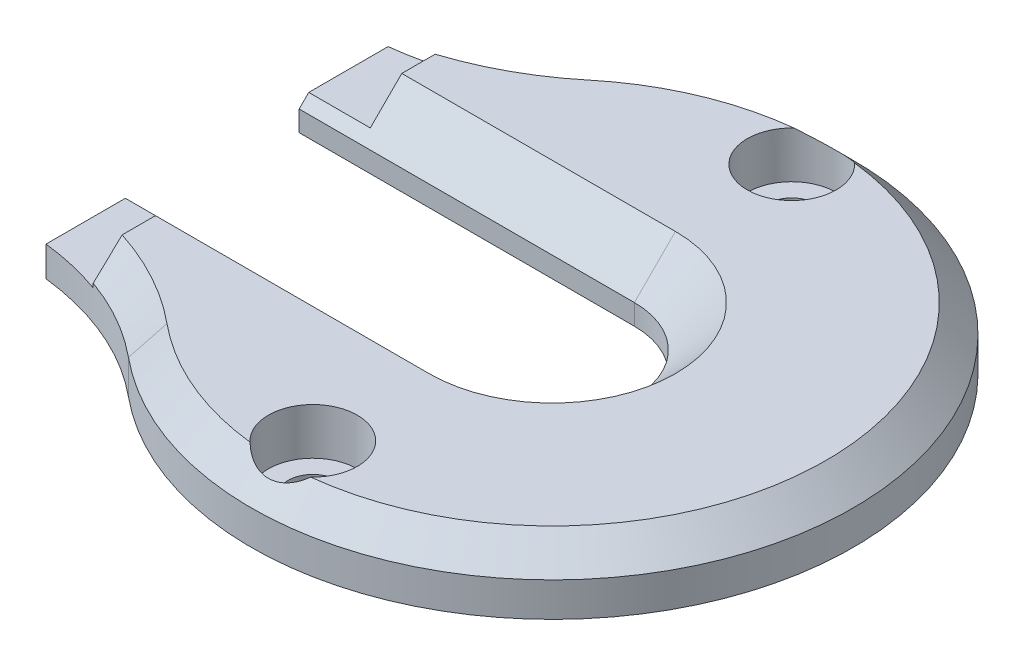
ISO-10303-21;
HEADER;
FILE_DESCRIPTION(('STEP AP214'),'2;1');
FILE_NAME('part.step','',(''),(''),'','','');
FILE_SCHEMA(('AUTOMOTIVE_DESIGN { 1 0 10303 214 1 1 1 1 }'));
ENDSEC;
DATA;
#1=APPLICATION_CONTEXT('core data for automotive mechanical design processes');
#2=APPLICATION_PROTOCOL_DEFINITION('international standard','automotive_design',2000,#1);
#3=PRODUCT_CONTEXT('',#1,'mechanical');
#4=PRODUCT('Part','Part','',(#3));
#5=PRODUCT_RELATED_PRODUCT_CATEGORY('part','',(#4));
#6=PRODUCT_DEFINITION_FORMATION('','',#4);
#7=PRODUCT_DEFINITION_CONTEXT('part definition',#1,'design');
#8=PRODUCT_DEFINITION('design','',#6,#7);
#9=PRODUCT_DEFINITION_SHAPE('','',#8);
#10=(LENGTH_UNIT() NAMED_UNIT(*) SI_UNIT(.MILLI.,.METRE.));
#11=(NAMED_UNIT(*) PLANE_ANGLE_UNIT() SI_UNIT($,.RADIAN.));
#12=(NAMED_UNIT(*) SI_UNIT($,.STERADIAN.) SOLID_ANGLE_UNIT());
#13=UNCERTAINTY_MEASURE_WITH_UNIT(LENGTH_MEASURE(1.E-05),#10,'distance_accuracy_value','');
#14=(GEOMETRIC_REPRESENTATION_CONTEXT(3) GLOBAL_UNCERTAINTY_ASSIGNED_CONTEXT((#13)) GLOBAL_UNIT_ASSIGNED_CONTEXT((#10,
#11,#12)) REPRESENTATION_CONTEXT('',''));
#15=CARTESIAN_POINT('',(0.,0.,0.));
#16=DIRECTION('',(0.,0.,1.));
#17=DIRECTION('',(1.,0.,0.));
#18=AXIS2_PLACEMENT_3D('',#15,#16,#17);
#19=CARTESIAN_POINT('',(-24.5000000000005,4.49999999999989,-12.5000000000005));
#20=DIRECTION('',(1.00000000000002,0.,0.));
#21=DIRECTION('',(0.,0.,-1.00000000000003));
#22=AXIS2_PLACEMENT_3D('',#19,#20,#21);
#23=PLANE('',#22);
#24=DIRECTION('',(0.,0.,1.00000000000003));
#25=VECTOR('',#24,1.);
#26=CARTESIAN_POINT('',(-24.5000000000003,2.20000000000016,-22.0000000000006));
#27=LINE('',#26,#25);
#28=CARTESIAN_POINT('',(-24.5000000000005,2.19999999999999,6.7000000000001));
#29=VERTEX_POINT('',#28);
#30=CARTESIAN_POINT('',(-24.5,2.19999999999994,12.5));
#31=VERTEX_POINT('',#30);
#32=EDGE_CURVE('E200',#29,#31,#27,.T.);
#33=ORIENTED_EDGE('',*,*,#32,.F.);
#34=DIRECTION('',(0.,-0.707106781186551,-0.707106781186566));
#35=VECTOR('',#34,1.);
#36=CARTESIAN_POINT('',(-24.5000000000002,1.49999999999997,6.00000000000001));
#37=LINE('',#36,#35);
#38=CARTESIAN_POINT('',(-24.5000000000002,1.49999999999997,6.00000000000001));
#39=VERTEX_POINT('',#38);
#40=EDGE_CURVE('E255',#29,#39,#37,.T.);
#41=ORIENTED_EDGE('',*,*,#40,.T.);
#42=DIRECTION('',(0.,1.00000000000001,0.));
#43=VECTOR('',#42,1.);
#44=CARTESIAN_POINT('',(-24.5000000000002,0.,6.00000000000001));
#45=LINE('',#44,#43);
#46=CARTESIAN_POINT('',(-24.5000000000002,0.,6.00000000000001));
#47=VERTEX_POINT('',#46);
#48=EDGE_CURVE('E195',#47,#39,#45,.T.);
#49=ORIENTED_EDGE('',*,*,#48,.F.);
#50=DIRECTION('',(0.,0.,1.00000000000003));
#51=VECTOR('',#50,1.);
#52=CARTESIAN_POINT('',(-24.5000000000002,-1.11022302462516E-13,-12.5000000000004));
#53=LINE('',#52,#51);
#54=CARTESIAN_POINT('',(-24.5,0.,12.4999999999999));
#55=VERTEX_POINT('',#54);
#56=EDGE_CURVE('E212',#47,#55,#53,.T.);
#57=ORIENTED_EDGE('',*,*,#56,.T.);
#58=DIRECTION('',(0.,-1.00000000000001,0.));
#59=VECTOR('',#58,1.);
#60=CARTESIAN_POINT('',(-24.5000000000003,4.49999999999995,12.5));
#61=LINE('',#60,#59);
#62=EDGE_CURVE('E215',#31,#55,#61,.T.);
#63=ORIENTED_EDGE('',*,*,#62,.F.);
#64=EDGE_LOOP('',(#33,#41,#49,#57,#63));
#65=FACE_BOUND('',#64,.T.);
#66=ADVANCED_FACE('F34',(#65),#23,.F.);
#67=CARTESIAN_POINT('',(-24.5000000000003,2.20000000000016,-22.0000000000006));
#68=DIRECTION('',(0.,-1.00000000000001,0.));
#69=DIRECTION('',(0.,0.,-1.00000000000003));
#70=AXIS2_PLACEMENT_3D('',#67,#68,#69);
#71=PLANE('',#70);
#72=DIRECTION('',(0.,0.,1.00000000000003));
#73=VECTOR('',#72,1.);
#74=CARTESIAN_POINT('',(-20.0000000000001,2.20000000000016,-22.0000000000016));
#75=LINE('',#74,#73);
#76=CARTESIAN_POINT('',(-20.,2.19999999999997,6.69999999999879));
#77=VERTEX_POINT('',#76);
#78=CARTESIAN_POINT('',(-20.,2.20000000000016,13.5487782180484));
#79=VERTEX_POINT('',#78);
#80=EDGE_CURVE('E206',#77,#79,#75,.T.);
#81=ORIENTED_EDGE('',*,*,#80,.F.);
#82=DIRECTION('',(-1.00000000000002,0.,0.));
#83=VECTOR('',#82,1.);
#84=CARTESIAN_POINT('',(-24.5000000000005,2.19999999999999,6.70000000000007));
#85=LINE('',#84,#83);
#86=EDGE_CURVE('E253',#77,#29,#85,.T.);
#87=ORIENTED_EDGE('',*,*,#86,.T.);
#88=ORIENTED_EDGE('',*,*,#32,.T.);
#89=CARTESIAN_POINT('',(-26.7591876918818,2.19999999999998,32.3719921239135));
#90=DIRECTION('',(0.,-1.00000000000001,0.));
#91=DIRECTION('',(0.,0.,-1.00000000000003));
#92=AXIS2_PLACEMENT_3D('',#89,#90,#91);
#93=CIRCLE('',#92,20.);
#94=EDGE_CURVE('E236',#31,#79,#93,.T.);
#95=ORIENTED_EDGE('',*,*,#94,.T.);
#96=EDGE_LOOP('',(#81,#87,#88,#95));
#97=FACE_BOUND('',#96,.T.);
#98=ADVANCED_FACE('F356',(#97),#71,.F.);
#99=CARTESIAN_POINT('',(-20.0000000000001,4.50000000000017,-22.0000000000015));
#100=DIRECTION('',(-1.00000000000002,0.,0.));
#101=DIRECTION('',(0.,0.,1.00000000000003));
#102=AXIS2_PLACEMENT_3D('',#99,#100,#101);
#103=PLANE('',#102);
#104=DIRECTION('',(0.,1.00000000000001,0.));
#105=VECTOR('',#104,1.);
#106=CARTESIAN_POINT('',(-20.,2.20000000000016,13.5487782180484));
#107=LINE('',#106,#105);
#108=CARTESIAN_POINT('',(-20.,2.50000000000015,13.5487782180484));
#109=VERTEX_POINT('',#108);
#110=EDGE_CURVE('E239',#79,#109,#107,.T.);
#111=ORIENTED_EDGE('',*,*,#110,.T.);
#112=CARTESIAN_POINT('',(-20.,2.50000000000015,13.5487782180484));
#113=CARTESIAN_POINT('',(-20.0000000000001,2.66615597314226,13.3722352485686));
#114=CARTESIAN_POINT('',(-20.0000000000001,2.83245278083959,13.1958248872219));
#115=CARTESIAN_POINT('',(-20.0000000000001,3.16530771760251,12.8432514951736));
#116=CARTESIAN_POINT('',(-20.0000000000001,3.33186584617099,12.6670884640027));
#117=CARTESIAN_POINT('',(-20.0000000000001,3.66522366643125,12.3149912203711));
#118=CARTESIAN_POINT('',(-20.0000000000001,3.8320233580621,12.1390570078527));
#119=CARTESIAN_POINT('',(-20.0000000000001,4.16584748976498,11.78740129302));
#120=CARTESIAN_POINT('',(-20.0000000000001,4.33287193026334,11.6116797911104));
#121=CARTESIAN_POINT('',(-20.0000000000001,4.49999999999995,11.4360569466646));
#122=B_SPLINE_CURVE_WITH_KNOTS('',3,(#112,#113,#114,#115,#116,#117,#118,#119,#120,#121),
.UNSPECIFIED.,.F.,.F.,(4,2,2,2,4),(0.,0.727307943102342,1.45461450432912,2.18192088209917,
2.90922864142605),.UNSPECIFIED.);
#123=CARTESIAN_POINT('',(-20.0000000000001,4.49999999999995,11.4360569466646));
#124=VERTEX_POINT('',#123);
#125=EDGE_CURVE('E286',#109,#124,#122,.T.);
#126=ORIENTED_EDGE('',*,*,#125,.T.);
#127=DIRECTION('',(0.,0.,1.00000000000003));
#128=VECTOR('',#127,1.);
#129=CARTESIAN_POINT('',(-20.,4.49999999999995,-1.33226762955019E-12));
#130=LINE('',#129,#128);
#131=CARTESIAN_POINT('',(-19.9999999999998,4.50000000000003,8.99999999999923));
#132=VERTEX_POINT('',#131);
#133=EDGE_CURVE('E221',#132,#124,#130,.T.);
#134=ORIENTED_EDGE('',*,*,#133,.F.);
#135=DIRECTION('',(0.,-0.707106781186551,-0.707106781186566));
#136=VECTOR('',#135,1.);
#137=CARTESIAN_POINT('',(-19.9999999999998,-10.9999999999999,-6.50000000000148));
#138=LINE('',#137,#136);
#139=EDGE_CURVE('E251',#132,#77,#138,.T.);
#140=ORIENTED_EDGE('',*,*,#139,.T.);
#141=ORIENTED_EDGE('',*,*,#80,.T.);
#142=EDGE_LOOP('',(#111,#126,#134,#140,#141));
#143=FACE_BOUND('',#142,.T.);
#144=ADVANCED_FACE('F354',(#143),#103,.T.);
#145=CARTESIAN_POINT('',(0.,4.49999999999993,1.11022302462516E-13));
#146=DIRECTION('',(0.,1.00000000000001,0.));
#147=DIRECTION('',(0.,0.,1.00000000000003));
#148=AXIS2_PLACEMENT_3D('',#145,#146,#147);
#149=PLANE('',#148);
#150=ORIENTED_EDGE('',*,*,#133,.T.);
#151=CARTESIAN_POINT('',(-26.7591876918821,4.5,32.3719921239135));
#152=DIRECTION('',(0.,1.00000000000001,0.));
#153=DIRECTION('',(0.,0.,1.00000000000003));
#154=AXIS2_PLACEMENT_3D('',#151,#152,#153);
#155=CIRCLE('',#154,22.);
#156=CARTESIAN_POINT('',(-12.7424703294669,4.49999999999989,15.4152343447206));
#157=VERTEX_POINT('',#156);
#158=EDGE_CURVE('E281',#124,#157,#155,.F.);
#159=ORIENTED_EDGE('',*,*,#158,.T.);
#160=CARTESIAN_POINT('',(0.,4.49999999999993,1.11022302462516E-13));
#161=DIRECTION('',(0.,1.00000000000001,0.));
#162=DIRECTION('',(0.,0.,1.00000000000003));
#163=AXIS2_PLACEMENT_3D('',#160,#161,#162);
#164=CIRCLE('',#163,20.);
#165=CARTESIAN_POINT('',(-2.21661671661294,4.49999999999999,19.8767857142864));
#166=VERTEX_POINT('',#165);
#167=EDGE_CURVE('E279',#157,#166,#164,.T.);
#168=ORIENTED_EDGE('',*,*,#167,.T.);
#169=CARTESIAN_POINT('',(0.,4.50000000000002,17.5000000000005));
#170=DIRECTION('',(0.,1.00000000000001,0.));
#171=DIRECTION('',(0.,0.,1.00000000000003));
#172=AXIS2_PLACEMENT_3D('',#169,#170,#171);
#173=CIRCLE('',#172,3.25);
#174=CARTESIAN_POINT('',(2.21661671661272,4.50000000000002,19.8767857142861));
#175=VERTEX_POINT('',#174);
#176=EDGE_CURVE('E273',#175,#166,#173,.T.);
#177=ORIENTED_EDGE('',*,*,#176,.F.);
#178=CARTESIAN_POINT('',(0.,4.49999999999993,1.11022302462516E-13));
#179=DIRECTION('',(0.,1.00000000000001,0.));
#180=DIRECTION('',(0.,0.,1.00000000000003));
#181=AXIS2_PLACEMENT_3D('',#178,#179,#180);
#182=CIRCLE('',#181,20.);
#183=CARTESIAN_POINT('',(2.21661671661286,4.5,-19.8767857142858));
#184=VERTEX_POINT('',#183);
#185=EDGE_CURVE('E277',#175,#184,#182,.T.);
#186=ORIENTED_EDGE('',*,*,#185,.T.);
#187=CARTESIAN_POINT('',(2.77555756156289E-13,4.49999999999991,-17.5000000000002));
#188=DIRECTION('',(0.,1.00000000000001,0.));
#189=DIRECTION('',(0.,0.,1.00000000000003));
#190=AXIS2_PLACEMENT_3D('',#187,#188,#189);
#191=CIRCLE('',#190,3.25);
#192=CARTESIAN_POINT('',(-2.21661671661277,4.49999999999995,-19.8767857142867));
#193=VERTEX_POINT('',#192);
#194=EDGE_CURVE('E410',#193,#184,#191,.T.);
#195=ORIENTED_EDGE('',*,*,#194,.F.);
#196=CARTESIAN_POINT('',(0.,4.49999999999993,1.11022302462516E-13));
#197=DIRECTION('',(0.,1.00000000000001,0.));
#198=DIRECTION('',(0.,0.,1.00000000000003));
#199=AXIS2_PLACEMENT_3D('',#196,#197,#198);
#200=CIRCLE('',#199,20.);
#201=CARTESIAN_POINT('',(-12.7424703294672,4.50000000000002,-15.4152343447212));
#202=VERTEX_POINT('',#201);
#203=EDGE_CURVE('E267',#193,#202,#200,.T.);
#204=ORIENTED_EDGE('',*,*,#203,.T.);
#205=CARTESIAN_POINT('',(-26.7591876918821,4.50000000000014,-32.3719921239137));
#206=DIRECTION('',(0.,1.00000000000001,0.));
#207=DIRECTION('',(0.,0.,1.00000000000003));
#208=AXIS2_PLACEMENT_3D('',#205,#206,#207);
#209=CIRCLE('',#208,22.);
#210=CARTESIAN_POINT('',(-19.9999999999999,4.5,-11.4360569466665));
#211=VERTEX_POINT('',#210);
#212=EDGE_CURVE('E275',#202,#211,#209,.F.);
#213=ORIENTED_EDGE('',*,*,#212,.T.);
#214=CARTESIAN_POINT('',(-20.,4.49999999999989,-9.00000000000148));
#215=VERTEX_POINT('',#214);
#216=EDGE_CURVE('E222',#211,#215,#130,.T.);
#217=ORIENTED_EDGE('',*,*,#216,.T.);
#218=DIRECTION('',(1.00000000000002,0.,0.));
#219=VECTOR('',#218,1.);
#220=CARTESIAN_POINT('',(1.38777878078145E-13,4.49999999999992,-9.00000000000017));
#221=LINE('',#220,#219);
#222=CARTESIAN_POINT('',(1.38777878078145E-13,4.49999999999992,-9.00000000000017));
#223=VERTEX_POINT('',#222);
#224=EDGE_CURVE('E247',#215,#223,#221,.T.);
#225=ORIENTED_EDGE('',*,*,#224,.T.);
#226=CARTESIAN_POINT('',(0.,4.49999999999993,1.11022302462516E-13));
#227=DIRECTION('',(0.,1.00000000000001,0.));
#228=DIRECTION('',(0.,0.,1.00000000000003));
#229=AXIS2_PLACEMENT_3D('',#226,#227,#228);
#230=CIRCLE('',#229,9.00000000000001);
#231=CARTESIAN_POINT('',(0.,4.49999999999998,9.00000000000045));
#232=VERTEX_POINT('',#231);
#233=EDGE_CURVE('E245',#223,#232,#230,.F.);
#234=ORIENTED_EDGE('',*,*,#233,.T.);
#235=DIRECTION('',(-1.00000000000002,0.,0.));
#236=VECTOR('',#235,1.);
#237=CARTESIAN_POINT('',(-19.9999999999998,4.50000000000003,8.99999999999923));
#238=LINE('',#237,#236);
#239=EDGE_CURVE('E249',#232,#132,#238,.T.);
#240=ORIENTED_EDGE('',*,*,#239,.T.);
#241=EDGE_LOOP('',(#150,#159,#168,#177,#186,#195,#204,#213,#217,#225,#234,#240));
#242=FACE_BOUND('',#241,.T.);
#243=ADVANCED_FACE('F375',(#242),#149,.T.);
#244=CARTESIAN_POINT('',(0.,4.49999999999993,1.11022302462516E-13));
#245=DIRECTION('',(0.,-1.00000000000001,0.));
#246=DIRECTION('',(0.,0.,-1.00000000000003));
#247=AXIS2_PLACEMENT_3D('',#244,#245,#246);
#248=CYLINDRICAL_SURFACE('',#247,22.);
#249=DIRECTION('',(0.,-1.00000000000001,0.));
#250=VECTOR('',#249,1.);
#251=CARTESIAN_POINT('',(-14.0167173624141,4.49999999999995,-16.9567577791931));
#252=LINE('',#251,#250);
#253=CARTESIAN_POINT('',(-14.0167173624141,0.,-16.9567577791932));
#254=VERTEX_POINT('',#253);
#255=CARTESIAN_POINT('',(-14.0167173624142,2.49999999999993,-16.9567577791932));
#256=VERTEX_POINT('',#255);
#257=EDGE_CURVE('E226',#254,#256,#252,.F.);
#258=ORIENTED_EDGE('',*,*,#257,.T.);
#259=CARTESIAN_POINT('',(0.,2.5,1.11022302462516E-13));
#260=DIRECTION('',(0.,1.00000000000001,0.));
#261=DIRECTION('',(0.,0.,1.00000000000003));
#262=AXIS2_PLACEMENT_3D('',#259,#260,#261);
#263=CIRCLE('',#262,22.);
#264=CARTESIAN_POINT('',(-14.0167173624142,2.49999999999999,16.9567577791931));
#265=VERTEX_POINT('',#264);
#266=EDGE_CURVE('E11',#256,#265,#263,.F.);
#267=ORIENTED_EDGE('',*,*,#266,.T.);
#268=DIRECTION('',(0.,-1.00000000000001,0.));
#269=VECTOR('',#268,1.);
#270=CARTESIAN_POINT('',(-14.0167173624141,4.5,16.9567577791931));
#271=LINE('',#270,#269);
#272=CARTESIAN_POINT('',(-14.0167173624141,0.,16.9567577791928));
#273=VERTEX_POINT('',#272);
#274=EDGE_CURVE('E224',#265,#273,#271,.T.);
#275=ORIENTED_EDGE('',*,*,#274,.T.);
#276=CARTESIAN_POINT('',(0.,0.,0.));
#277=DIRECTION('',(0.,1.00000000000001,0.));
#278=DIRECTION('',(0.,0.,1.00000000000003));
#279=AXIS2_PLACEMENT_3D('',#276,#277,#278);
#280=CIRCLE('',#279,22.);
#281=EDGE_CURVE('E205',#273,#254,#280,.T.);
#282=ORIENTED_EDGE('',*,*,#281,.T.);
#283=EDGE_LOOP('',(#258,#267,#275,#282));
#284=FACE_BOUND('',#283,.T.);
#285=ADVANCED_FACE('F368',(#284),#248,.T.);
#286=DIRECTION('',(0.,1.00000000000001,0.));
#287=VECTOR('',#286,1.);
#288=CARTESIAN_POINT('',(-24.5000000000007,1.11022302462516E-13,-6.00000000000031));
#289=LINE('',#288,#287);
#290=CARTESIAN_POINT('',(-24.5000000000007,1.11022302462516E-13,-6.00000000000031));
#291=VERTEX_POINT('',#290);
#292=CARTESIAN_POINT('',(-24.5000000000007,1.50000000000011,-6.00000000000042));
#293=VERTEX_POINT('',#292);
#294=EDGE_CURVE('E174',#291,#293,#289,.T.);
#295=ORIENTED_EDGE('',*,*,#294,.T.);
#296=DIRECTION('',(0.,0.707106781186551,-0.707106781186566));
#297=VECTOR('',#296,1.);
#298=CARTESIAN_POINT('',(-24.5000000000007,1.50000000000011,-6.00000000000042));
#299=LINE('',#298,#297);
#300=CARTESIAN_POINT('',(-24.4999999999997,2.20000000000013,-6.7000000000004));
#301=VERTEX_POINT('',#300);
#302=EDGE_CURVE('E259',#293,#301,#299,.T.);
#303=ORIENTED_EDGE('',*,*,#302,.T.);
#304=CARTESIAN_POINT('',(-24.5000000000002,2.19999999999988,-12.5000000000006));
#305=VERTEX_POINT('',#304);
#306=EDGE_CURVE('E207',#305,#301,#27,.T.);
#307=ORIENTED_EDGE('',*,*,#306,.F.);
#308=DIRECTION('',(0.,-1.00000000000001,0.));
#309=VECTOR('',#308,1.);
#310=CARTESIAN_POINT('',(-24.5000000000005,4.49999999999989,-12.5000000000005));
#311=LINE('',#310,#309);
#312=CARTESIAN_POINT('',(-24.5000000000002,-1.11022302462516E-13,-12.5000000000004));
#313=VERTEX_POINT('',#312);
#314=EDGE_CURVE('E218',#305,#313,#311,.T.);
#315=ORIENTED_EDGE('',*,*,#314,.T.);
#316=EDGE_CURVE('E213',#313,#291,#53,.T.);
#317=ORIENTED_EDGE('',*,*,#316,.T.);
#318=EDGE_LOOP('',(#295,#303,#307,#315,#317));
#319=FACE_BOUND('',#318,.T.);
#320=ADVANCED_FACE('F359',(#319),#23,.F.);
#321=CARTESIAN_POINT('',(0.,0.,0.));
#322=DIRECTION('',(0.,1.00000000000001,0.));
#323=DIRECTION('',(0.,0.,1.00000000000003));
#324=AXIS2_PLACEMENT_3D('',#321,#322,#323);
#325=PLANE('',#324);
#326=CARTESIAN_POINT('',(0.,0.,17.5000000000004));
#327=DIRECTION('',(0.,1.00000000000001,0.));
#328=DIRECTION('',(0.,0.,1.00000000000003));
#329=AXIS2_PLACEMENT_3D('',#326,#327,#328);
#330=CIRCLE('',#329,1.8);
#331=CARTESIAN_POINT('',(0.,0.,19.3000000000004));
#332=VERTEX_POINT('',#331);
#333=EDGE_CURVE('E412',#332,#332,#330,.T.);
#334=ORIENTED_EDGE('',*,*,#333,.T.);
#335=EDGE_LOOP('',(#334));
#336=FACE_BOUND('',#335,.T.);
#337=CARTESIAN_POINT('',(2.77555756156289E-13,0.,-17.5000000000002));
#338=DIRECTION('',(0.,1.00000000000001,0.));
#339=DIRECTION('',(0.,0.,1.00000000000003));
#340=AXIS2_PLACEMENT_3D('',#337,#338,#339);
#341=CIRCLE('',#340,1.8);
#342=CARTESIAN_POINT('',(2.77555756156291E-13,0.,-15.7000000000002));
#343=VERTEX_POINT('',#342);
#344=EDGE_CURVE('E187',#343,#343,#341,.T.);
#345=ORIENTED_EDGE('',*,*,#344,.T.);
#346=EDGE_LOOP('',(#345));
#347=FACE_BOUND('',#346,.T.);
#348=ORIENTED_EDGE('',*,*,#56,.F.);
#349=DIRECTION('',(1.00000000000002,0.,0.));
#350=VECTOR('',#349,1.);
#351=CARTESIAN_POINT('',(-24.5000000000002,0.,6.00000000000001));
#352=LINE('',#351,#350);
#353=CARTESIAN_POINT('',(1.66533453693773E-13,0.,6.0000000000002));
#354=VERTEX_POINT('',#353);
#355=EDGE_CURVE('E175',#47,#354,#352,.T.);
#356=ORIENTED_EDGE('',*,*,#355,.T.);
#357=CARTESIAN_POINT('',(0.,0.,0.));
#358=DIRECTION('',(0.,1.00000000000001,0.));
#359=DIRECTION('',(0.,0.,1.00000000000003));
#360=AXIS2_PLACEMENT_3D('',#357,#358,#359);
#361=CIRCLE('',#360,6.);
#362=CARTESIAN_POINT('',(0.,0.,-6.00000000000014));
#363=VERTEX_POINT('',#362);
#364=EDGE_CURVE('E168',#354,#363,#361,.T.);
#365=ORIENTED_EDGE('',*,*,#364,.T.);
#366=DIRECTION('',(-1.00000000000002,0.,0.));
#367=VECTOR('',#366,1.);
#368=CARTESIAN_POINT('',(0.,0.,-6.00000000000014));
#369=LINE('',#368,#367);
#370=EDGE_CURVE('E178',#363,#291,#369,.T.);
#371=ORIENTED_EDGE('',*,*,#370,.T.);
#372=ORIENTED_EDGE('',*,*,#316,.F.);
#373=CARTESIAN_POINT('',(-26.7591876918818,1.38777878078145E-13,-32.3719921239136));
#374=DIRECTION('',(0.,1.00000000000001,0.));
#375=DIRECTION('',(0.,0.,1.00000000000003));
#376=AXIS2_PLACEMENT_3D('',#373,#374,#375);
#377=CIRCLE('',#376,20.);
#378=EDGE_CURVE('E228',#313,#254,#377,.T.);
#379=ORIENTED_EDGE('',*,*,#378,.T.);
#380=ORIENTED_EDGE('',*,*,#281,.F.);
#381=CARTESIAN_POINT('',(-26.7591876918818,0.,32.3719921239135));
#382=DIRECTION('',(0.,1.00000000000001,0.));
#383=DIRECTION('',(0.,0.,1.00000000000003));
#384=AXIS2_PLACEMENT_3D('',#381,#382,#383);
#385=CIRCLE('',#384,20.);
#386=EDGE_CURVE('E234',#273,#55,#385,.T.);
#387=ORIENTED_EDGE('',*,*,#386,.T.);
#388=EDGE_LOOP('',(#348,#356,#365,#371,#372,#379,#380,#387));
#389=FACE_BOUND('',#388,.T.);
#390=ADVANCED_FACE('F186',(#336,#347,#389),#325,.F.);
#391=ORIENTED_EDGE('',*,*,#306,.T.);
#392=DIRECTION('',(1.00000000000002,0.,0.));
#393=VECTOR('',#392,1.);
#394=CARTESIAN_POINT('',(1.66533453693773E-13,2.20000000000002,-6.70000000000004));
#395=LINE('',#394,#393);
#396=CARTESIAN_POINT('',(-19.9999999999999,2.20000000000009,-6.70000000000168));
#397=VERTEX_POINT('',#396);
#398=EDGE_CURVE('E261',#301,#397,#395,.T.);
#399=ORIENTED_EDGE('',*,*,#398,.T.);
#400=CARTESIAN_POINT('',(-19.9999999999996,2.19999999999997,-13.5487782180501));
#401=VERTEX_POINT('',#400);
#402=EDGE_CURVE('E202',#401,#397,#75,.T.);
#403=ORIENTED_EDGE('',*,*,#402,.F.);
#404=CARTESIAN_POINT('',(-26.7591876918817,2.20000000000013,-32.3719921239138));
#405=DIRECTION('',(0.,-1.00000000000001,0.));
#406=DIRECTION('',(0.,0.,-1.00000000000003));
#407=AXIS2_PLACEMENT_3D('',#404,#405,#406);
#408=CIRCLE('',#407,20.);
#409=EDGE_CURVE('E232',#401,#305,#408,.T.);
#410=ORIENTED_EDGE('',*,*,#409,.T.);
#411=EDGE_LOOP('',(#391,#399,#403,#410));
#412=FACE_BOUND('',#411,.T.);
#413=ADVANCED_FACE('F353',(#412),#71,.F.);
#414=ORIENTED_EDGE('',*,*,#216,.F.);
#415=CARTESIAN_POINT('',(-19.9999999999999,4.5,-11.4360569466665));
#416=CARTESIAN_POINT('',(-20.0000000000001,4.33287193026286,-11.6116797911118));
#417=CARTESIAN_POINT('',(-20.0000000000001,4.16584748976428,-11.7874012930212));
#418=CARTESIAN_POINT('',(-20.0000000000001,3.83202335806125,-12.1390570078538));
#419=CARTESIAN_POINT('',(-20.0000000000001,3.66522366643047,-12.3149912203722));
#420=CARTESIAN_POINT('',(-20.0000000000001,3.33186584617021,-12.6670884640039));
#421=CARTESIAN_POINT('',(-20.0000000000002,3.16530771760167,-12.8432514951747));
#422=CARTESIAN_POINT('',(-20.0000000000001,2.83245278083884,-13.1958248872231));
#423=CARTESIAN_POINT('',(-19.9999999999999,2.66615597314165,-13.3722352485699));
#424=CARTESIAN_POINT('',(-19.9999999999996,2.49999999999996,-13.5487782180501));
#425=B_SPLINE_CURVE_WITH_KNOTS('',3,(#415,#416,#417,#418,#419,#420,#421,#422,#423,#424),
.UNSPECIFIED.,.F.,.F.,(4,2,2,2,4),(0.,0.727307759326899,1.45461413709697,2.18192069832377,
2.90922864142614),.UNSPECIFIED.);
#426=CARTESIAN_POINT('',(-19.9999999999996,2.49999999999996,-13.5487782180501));
#427=VERTEX_POINT('',#426);
#428=EDGE_CURVE('E60',#211,#427,#425,.T.);
#429=ORIENTED_EDGE('',*,*,#428,.T.);
#430=DIRECTION('',(0.,1.00000000000001,0.));
#431=VECTOR('',#430,1.);
#432=CARTESIAN_POINT('',(-19.9999999999996,4.5,-13.54877821805));
#433=LINE('',#432,#431);
#434=EDGE_CURVE('E230',#427,#401,#433,.F.);
#435=ORIENTED_EDGE('',*,*,#434,.T.);
#436=ORIENTED_EDGE('',*,*,#402,.T.);
#437=DIRECTION('',(0.,0.707106781186551,-0.707106781186566));
#438=VECTOR('',#437,1.);
#439=CARTESIAN_POINT('',(-19.9999999999994,11.0000000000002,-15.5000000000017));
#440=LINE('',#439,#438);
#441=EDGE_CURVE('E263',#397,#215,#440,.T.);
#442=ORIENTED_EDGE('',*,*,#441,.T.);
#443=EDGE_LOOP('',(#414,#429,#435,#436,#442));
#444=FACE_BOUND('',#443,.T.);
#445=ADVANCED_FACE('F299',(#444),#103,.T.);
#446=CARTESIAN_POINT('',(0.,0.,0.));
#447=DIRECTION('',(0.,1.00000000000001,0.));
#448=DIRECTION('',(0.,0.,1.00000000000003));
#449=AXIS2_PLACEMENT_3D('',#446,#447,#448);
#450=CYLINDRICAL_SURFACE('',#449,6.);
#451=DIRECTION('',(0.,1.00000000000001,0.));
#452=VECTOR('',#451,1.);
#453=CARTESIAN_POINT('',(1.66533453693773E-13,0.,6.0000000000002));
#454=LINE('',#453,#452);
#455=CARTESIAN_POINT('',(1.66533453693773E-13,1.5,6.0000000000002));
#456=VERTEX_POINT('',#455);
#457=EDGE_CURVE('E198',#354,#456,#454,.T.);
#458=ORIENTED_EDGE('',*,*,#457,.T.);
#459=CARTESIAN_POINT('',(0.,1.5,0.));
#460=DIRECTION('',(0.,1.00000000000001,0.));
#461=DIRECTION('',(0.,0.,1.00000000000003));
#462=AXIS2_PLACEMENT_3D('',#459,#460,#461);
#463=CIRCLE('',#462,6.);
#464=CARTESIAN_POINT('',(0.,1.50000000000006,-6.00000000000014));
#465=VERTEX_POINT('',#464);
#466=EDGE_CURVE('E171',#456,#465,#463,.T.);
#467=ORIENTED_EDGE('',*,*,#466,.T.);
#468=DIRECTION('',(0.,1.00000000000001,0.));
#469=VECTOR('',#468,1.);
#470=CARTESIAN_POINT('',(0.,0.,-6.00000000000014));
#471=LINE('',#470,#469);
#472=EDGE_CURVE('E163',#363,#465,#471,.T.);
#473=ORIENTED_EDGE('',*,*,#472,.F.);
#474=ORIENTED_EDGE('',*,*,#364,.F.);
#475=EDGE_LOOP('',(#458,#467,#473,#474));
#476=FACE_BOUND('',#475,.T.);
#477=ADVANCED_FACE('F166',(#476),#450,.F.);
#478=CARTESIAN_POINT('',(-24.5000000000002,0.,6.00000000000001));
#479=DIRECTION('',(0.,0.,1.00000000000003));
#480=DIRECTION('',(1.00000000000002,0.,0.));
#481=AXIS2_PLACEMENT_3D('',#478,#479,#480);
#482=PLANE('',#481);
#483=ORIENTED_EDGE('',*,*,#48,.T.);
#484=DIRECTION('',(1.00000000000002,0.,0.));
#485=VECTOR('',#484,1.);
#486=CARTESIAN_POINT('',(1.66533453693773E-13,1.5,6.0000000000002));
#487=LINE('',#486,#485);
#488=EDGE_CURVE('E242',#39,#456,#487,.T.);
#489=ORIENTED_EDGE('',*,*,#488,.T.);
#490=ORIENTED_EDGE('',*,*,#457,.F.);
#491=ORIENTED_EDGE('',*,*,#355,.F.);
#492=EDGE_LOOP('',(#483,#489,#490,#491));
#493=FACE_BOUND('',#492,.T.);
#494=ADVANCED_FACE('F344',(#493),#482,.F.);
#495=CARTESIAN_POINT('',(0.,0.,-6.00000000000014));
#496=DIRECTION('',(0.,0.,-1.00000000000003));
#497=DIRECTION('',(-1.00000000000002,0.,0.));
#498=AXIS2_PLACEMENT_3D('',#495,#496,#497);
#499=PLANE('',#498);
#500=ORIENTED_EDGE('',*,*,#472,.T.);
#501=DIRECTION('',(-1.00000000000002,0.,0.));
#502=VECTOR('',#501,1.);
#503=CARTESIAN_POINT('',(-20.0000000000001,1.50000000000008,-6.00000000000181));
#504=LINE('',#503,#502);
#505=EDGE_CURVE('E257',#465,#293,#504,.T.);
#506=ORIENTED_EDGE('',*,*,#505,.T.);
#507=ORIENTED_EDGE('',*,*,#294,.F.);
#508=ORIENTED_EDGE('',*,*,#370,.F.);
#509=EDGE_LOOP('',(#500,#506,#507,#508));
#510=FACE_BOUND('',#509,.T.);
#511=ADVANCED_FACE('F179',(#510),#499,.F.);
#512=CARTESIAN_POINT('',(2.77555756156289E-13,4.49999999999991,-17.5000000000002));
#513=DIRECTION('',(0.,1.00000000000001,0.));
#514=DIRECTION('',(0.,0.,1.00000000000003));
#515=AXIS2_PLACEMENT_3D('',#512,#513,#514);
#516=CYLINDRICAL_SURFACE('',#515,1.8);
#517=ORIENTED_EDGE('',*,*,#344,.F.);
#518=EDGE_LOOP('',(#517));
#519=FACE_BOUND('',#518,.T.);
#520=CARTESIAN_POINT('',(2.77555756156289E-13,1.09999999999995,-17.5000000000002));
#521=DIRECTION('',(0.,1.00000000000001,0.));
#522=DIRECTION('',(0.,0.,1.00000000000003));
#523=AXIS2_PLACEMENT_3D('',#520,#521,#522);
#524=CIRCLE('',#523,1.8);
#525=CARTESIAN_POINT('',(2.77555756156291E-13,1.09999999999995,-15.7000000000002));
#526=VERTEX_POINT('',#525);
#527=EDGE_CURVE('E190',#526,#526,#524,.T.);
#528=ORIENTED_EDGE('',*,*,#527,.T.);
#529=EDGE_LOOP('',(#528));
#530=FACE_BOUND('',#529,.T.);
#531=ADVANCED_FACE('F339',(#519,#530),#516,.F.);
#532=CARTESIAN_POINT('',(1.80000000000027,1.09999999999995,-17.5000000000018));
#533=DIRECTION('',(0.,-1.00000000000001,0.));
#534=DIRECTION('',(0.,0.,-1.00000000000003));
#535=AXIS2_PLACEMENT_3D('',#532,#533,#534);
#536=PLANE('',#535);
#537=ORIENTED_EDGE('',*,*,#527,.F.);
#538=EDGE_LOOP('',(#537));
#539=FACE_BOUND('',#538,.T.);
#540=CARTESIAN_POINT('',(2.77555756156289E-13,1.09999999999995,-17.5000000000002));
#541=DIRECTION('',(0.,1.00000000000001,0.));
#542=DIRECTION('',(0.,0.,1.00000000000003));
#543=AXIS2_PLACEMENT_3D('',#540,#541,#542);
#544=CIRCLE('',#543,3.25);
#545=CARTESIAN_POINT('',(2.77555756156292E-13,1.09999999999995,-14.2500000000001));
#546=VERTEX_POINT('',#545);
#547=EDGE_CURVE('E411',#546,#546,#544,.T.);
#548=ORIENTED_EDGE('',*,*,#547,.T.);
#549=EDGE_LOOP('',(#548));
#550=FACE_BOUND('',#549,.T.);
#551=ADVANCED_FACE('F334',(#539,#550),#536,.F.);
#552=CARTESIAN_POINT('',(2.77555756156289E-13,4.49999999999991,-17.5000000000002));
#553=DIRECTION('',(0.,1.00000000000001,0.));
#554=DIRECTION('',(0.,0.,1.00000000000003));
#555=AXIS2_PLACEMENT_3D('',#552,#553,#554);
#556=CYLINDRICAL_SURFACE('',#555,3.25);
#557=ORIENTED_EDGE('',*,*,#547,.F.);
#558=EDGE_LOOP('',(#557));
#559=FACE_BOUND('',#558,.T.);
#560=ORIENTED_EDGE('',*,*,#194,.T.);
#561=CARTESIAN_POINT('',(2.21661671661286,4.5,-19.8767857142858));
#562=CARTESIAN_POINT('',(2.16168442333873,4.45518510006324,-19.9280021696503));
#563=CARTESIAN_POINT('',(2.10442784028393,4.41172019448179,-19.9778492298232));
#564=CARTESIAN_POINT('',(1.98515483119643,4.32777708937159,-20.0744090410791));
#565=CARTESIAN_POINT('',(1.92313371693623,4.28730191051388,-20.1211186180014));
#566=CARTESIAN_POINT('',(1.72892775393273,4.17032019192523,-20.2564937942756));
#567=CARTESIAN_POINT('',(1.58945177490115,4.0989646574014,-20.3395955421994));
#568=CARTESIAN_POINT('',(1.36708049635604,4.00483385764806,-20.4496666026798));
#569=CARTESIAN_POINT('',(1.29045424322532,3.9755227439631,-20.4840268916229));
#570=CARTESIAN_POINT('',(1.13331474811757,3.92175437108424,-20.5471706591587));
#571=CARTESIAN_POINT('',(1.05280387119045,3.89729420374625,-20.5759574788009));
#572=CARTESIAN_POINT('',(0.888749071867154,3.85373189406296,-20.6272974924856));
#573=CARTESIAN_POINT('',(0.805217068054115,3.83461084267874,-20.6498726814141));
#574=CARTESIAN_POINT('',(0.635575936231594,3.80198287859632,-20.6884327325783));
#575=CARTESIAN_POINT('',(0.549467330302673,3.78847483671732,-20.7044189203319));
#576=CARTESIAN_POINT('',(0.387020738921128,3.76875011839468,-20.7277753831885));
#577=CARTESIAN_POINT('',(0.310892964530339,3.7618064675553,-20.7360042718037));
#578=CARTESIAN_POINT('',(0.157939426598754,3.75247433115829,-20.7470656945931));
#579=CARTESIAN_POINT('',(0.0811134433964582,3.7500873327825,-20.7498964669515));
#580=CARTESIAN_POINT('',(-0.0725587950673684,3.74991741491299,-20.750097903637));
#581=CARTESIAN_POINT('',(-0.149405051226284,3.752134754471,-20.7474682607472));
#582=CARTESIAN_POINT('',(-0.302461911387911,3.76112980501736,-20.7368062751548));
#583=CARTESIAN_POINT('',(-0.378672269999301,3.76790920093145,-20.7287719363108));
#584=CARTESIAN_POINT('',(-0.592223679800561,3.79337699194353,-20.6986127771793));
#585=CARTESIAN_POINT('',(-0.728150476229505,3.81727581995285,-20.670331987309));
#586=CARTESIAN_POINT('',(-0.992305807251828,3.87870114453263,-20.5978439972394));
#587=CARTESIAN_POINT('',(-1.12053461723285,3.91622715326559,-20.5536373671673));
#588=CARTESIAN_POINT('',(-1.37482972555732,4.00597494576952,-20.4482979672891));
#589=CARTESIAN_POINT('',(-1.50024687226043,4.05897577944609,-20.3862718495836));
#590=CARTESIAN_POINT('',(-1.73816329780985,4.17634779698391,-20.2495687780493));
#591=CARTESIAN_POINT('',(-1.85065940284539,4.24072176462756,-20.1748887271226));
#592=CARTESIAN_POINT('',(-2.00231851092228,4.33980146104114,-20.0605770051912));
#593=CARTESIAN_POINT('',(-2.04706746109578,4.37077150583851,-20.0249237019532));
#594=CARTESIAN_POINT('',(-2.13384106827135,4.43424985940755,-19.9520235473071));
#595=CARTESIAN_POINT('',(-2.17587274155871,4.46675379808312,-19.914781248979));
#596=CARTESIAN_POINT('',(-2.21661671661302,4.49999999999973,-19.8767857142869));
#597=B_SPLINE_CURVE_WITH_KNOTS('',3,(#561,#562,#563,#564,#565,#566,#567,#568,#569,#570,#571,
#572,#573,#574,#575,#576,#577,#578,#579,#580,#581,#582,#583,#584,#585,#586,#587,#588,#589,#590,
#591,#592,#593,#594,#595,#596),.UNSPECIFIED.,.F.,.F.,(4,2,2,2,2,2,2,2,2,2,2,2,2,2,2,2,2,4),(0.,
0.262240338573845,0.524742106923069,1.05382134877636,1.32034962337945,1.58671762793953,
1.85212993806397,2.11748882876205,2.34782901529984,2.57824436649211,2.80867268178752,
3.03918614900136,3.45978900227701,3.88037679993539,4.3275527115686,4.77483822970548,
4.96994359297322,5.16452320009251),.UNSPECIFIED.);
#598=EDGE_CURVE('E44',#184,#193,#597,.T.);
#599=ORIENTED_EDGE('',*,*,#598,.T.);
#600=EDGE_LOOP('',(#560,#599));
#601=FACE_BOUND('',#600,.T.);
#602=ADVANCED_FACE('F328',(#559,#601),#556,.F.);
#603=CARTESIAN_POINT('',(0.,4.50000000000002,17.5000000000005));
#604=DIRECTION('',(0.,1.00000000000001,0.));
#605=DIRECTION('',(0.,0.,1.00000000000003));
#606=AXIS2_PLACEMENT_3D('',#603,#604,#605);
#607=CYLINDRICAL_SURFACE('',#606,1.8);
#608=ORIENTED_EDGE('',*,*,#333,.F.);
#609=EDGE_LOOP('',(#608));
#610=FACE_BOUND('',#609,.T.);
#611=CARTESIAN_POINT('',(0.,1.10000000000006,17.5000000000004));
#612=DIRECTION('',(0.,1.00000000000001,0.));
#613=DIRECTION('',(0.,0.,1.00000000000003));
#614=AXIS2_PLACEMENT_3D('',#611,#612,#613);
#615=CIRCLE('',#614,1.8);
#616=CARTESIAN_POINT('',(0.,1.10000000000006,19.3000000000004));
#617=VERTEX_POINT('',#616);
#618=EDGE_CURVE('E417',#617,#617,#615,.T.);
#619=ORIENTED_EDGE('',*,*,#618,.T.);
#620=EDGE_LOOP('',(#619));
#621=FACE_BOUND('',#620,.T.);
#622=ADVANCED_FACE('F333',(#610,#621),#607,.F.);
#623=CARTESIAN_POINT('',(1.80000000000008,1.10000000000006,17.4999999999997));
#624=DIRECTION('',(0.,-1.00000000000001,0.));
#625=DIRECTION('',(0.,0.,-1.00000000000003));
#626=AXIS2_PLACEMENT_3D('',#623,#624,#625);
#627=PLANE('',#626);
#628=ORIENTED_EDGE('',*,*,#618,.F.);
#629=EDGE_LOOP('',(#628));
#630=FACE_BOUND('',#629,.T.);
#631=CARTESIAN_POINT('',(0.,1.10000000000006,17.5000000000004));
#632=DIRECTION('',(0.,1.00000000000001,0.));
#633=DIRECTION('',(0.,0.,1.00000000000003));
#634=AXIS2_PLACEMENT_3D('',#631,#632,#633);
#635=CIRCLE('',#634,3.25);
#636=CARTESIAN_POINT('',(0.,1.10000000000006,20.7500000000005));
#637=VERTEX_POINT('',#636);
#638=EDGE_CURVE('E405',#637,#637,#635,.T.);
#639=ORIENTED_EDGE('',*,*,#638,.T.);
#640=EDGE_LOOP('',(#639));
#641=FACE_BOUND('',#640,.T.);
#642=ADVANCED_FACE('F430',(#630,#641),#627,.F.);
#643=CARTESIAN_POINT('',(0.,4.50000000000002,17.5000000000005));
#644=DIRECTION('',(0.,1.00000000000001,0.));
#645=DIRECTION('',(0.,0.,1.00000000000003));
#646=AXIS2_PLACEMENT_3D('',#643,#644,#645);
#647=CYLINDRICAL_SURFACE('',#646,3.25);
#648=ORIENTED_EDGE('',*,*,#638,.F.);
#649=EDGE_LOOP('',(#648));
#650=FACE_BOUND('',#649,.T.);
#651=ORIENTED_EDGE('',*,*,#176,.T.);
#652=CARTESIAN_POINT('',(-2.21661671661294,4.49999999999999,19.8767857142864));
#653=CARTESIAN_POINT('',(-2.16168442333862,4.45518510006324,19.9280021696507));
#654=CARTESIAN_POINT('',(-2.10442784028374,4.41172019448178,19.9778492298235));
#655=CARTESIAN_POINT('',(-1.98515483119621,4.32777708937158,20.0744090410793));
#656=CARTESIAN_POINT('',(-1.92313371693605,4.28730191051386,20.1211186180016));
#657=CARTESIAN_POINT('',(-1.72892775393262,4.17032019192525,20.2564937942759));
#658=CARTESIAN_POINT('',(-1.58945177490105,4.09896465740151,20.3395955421997));
#659=CARTESIAN_POINT('',(-1.36708049635597,4.00483385764811,20.4496666026801));
#660=CARTESIAN_POINT('',(-1.29045424322526,3.9755227439631,20.4840268916232));
#661=CARTESIAN_POINT('',(-1.13331474811752,3.9217543710842,20.5471706591589));
#662=CARTESIAN_POINT('',(-1.0528038711904,3.89729420374622,20.5759574788011));
#663=CARTESIAN_POINT('',(-0.888749071867152,3.8537318940629,20.627297492486));
#664=CARTESIAN_POINT('',(-0.805217068054175,3.83461084267865,20.6498726814146));
#665=CARTESIAN_POINT('',(-0.63557593623156,3.80198287859629,20.6884327325783));
#666=CARTESIAN_POINT('',(-0.549467330302481,3.78847483671738,20.7044189203311));
#667=CARTESIAN_POINT('',(-0.387020738920852,3.7687501183947,20.7277753831879));
#668=CARTESIAN_POINT('',(-0.310892964530104,3.76180646755521,20.7360042718038));
#669=CARTESIAN_POINT('',(-0.157939426598554,3.75247433115813,20.7470656945936));
#670=CARTESIAN_POINT('',(-0.0811134433962529,3.75008733278236,20.7498964669518));
#671=CARTESIAN_POINT('',(0.0725587950676224,3.74991741491284,20.7500979036373));
#672=CARTESIAN_POINT('',(0.149405051226581,3.75213475447082,20.7474682607479));
#673=CARTESIAN_POINT('',(0.302461911388173,3.76112980501725,20.7368062751548));
#674=CARTESIAN_POINT('',(0.378672269999484,3.76790920093146,20.7287719363098));
#675=CARTESIAN_POINT('',(0.592223679800916,3.79337699194371,20.6986127771775));
#676=CARTESIAN_POINT('',(0.728150476230382,3.81727581995291,20.670331987309));
#677=CARTESIAN_POINT('',(0.992305807252945,3.87870114453257,20.5978439972397));
#678=CARTESIAN_POINT('',(1.12053461723369,3.91622715326552,20.5536373671663));
#679=CARTESIAN_POINT('',(1.37482972555827,4.00597494576962,20.4482979672877));
#680=CARTESIAN_POINT('',(1.50024687226185,4.05897577944637,20.3862718495834));
#681=CARTESIAN_POINT('',(1.73816329781093,4.17634779698421,20.2495687780491));
#682=CARTESIAN_POINT('',(1.85065940284566,4.24072176462773,20.1748887271211));
#683=CARTESIAN_POINT('',(2.00231851092287,4.33980146104136,20.0605770051903));
#684=CARTESIAN_POINT('',(2.04706746109663,4.37077150583874,20.0249237019528));
#685=CARTESIAN_POINT('',(2.13384106827227,4.43424985940778,19.9520235473073));
#686=CARTESIAN_POINT('',(2.17587274155946,4.46675379808332,19.9147812489792));
#687=CARTESIAN_POINT('',(2.21661671661297,4.49999999999982,19.8767857142862));
#688=B_SPLINE_CURVE_WITH_KNOTS('',3,(#652,#653,#654,#655,#656,#657,#658,#659,#660,#661,#662,
#663,#664,#665,#666,#667,#668,#669,#670,#671,#672,#673,#674,#675,#676,#677,#678,#679,#680,#681,
#682,#683,#684,#685,#686,#687),.UNSPECIFIED.,.F.,.F.,(4,2,2,2,2,2,2,2,2,2,2,2,2,2,2,2,2,4),(0.,
0.262240338573822,0.52474210692299,1.05382134877623,1.32034962337929,1.58671762793938,
1.85212993806375,2.1174888287619,2.34782901529984,2.57824436649208,2.80867268178753,
3.03918614900152,3.45978900227763,3.88037679993642,4.32755271156952,4.77483822970634,
4.96994359297374,5.16452320009269),.UNSPECIFIED.);
#689=EDGE_CURVE('E316',#166,#175,#688,.T.);
#690=ORIENTED_EDGE('',*,*,#689,.T.);
#691=EDGE_LOOP('',(#651,#690));
#692=FACE_BOUND('',#691,.T.);
#693=ADVANCED_FACE('F398',(#650,#692),#647,.F.);
#694=CARTESIAN_POINT('',(-26.7591876918821,4.50000000000014,-32.3719921239137));
#695=DIRECTION('',(0.,1.00000000000001,0.));
#696=DIRECTION('',(0.,0.,1.00000000000003));
#697=AXIS2_PLACEMENT_3D('',#694,#695,#696);
#698=CYLINDRICAL_SURFACE('',#697,20.);
#699=ORIENTED_EDGE('',*,*,#434,.F.);
#700=CARTESIAN_POINT('',(-26.7591876918817,2.50000000000013,-32.3719921239138));
#701=DIRECTION('',(0.,1.00000000000001,0.));
#702=DIRECTION('',(0.,0.,1.00000000000003));
#703=AXIS2_PLACEMENT_3D('',#700,#701,#702);
#704=CIRCLE('',#703,20.);
#705=EDGE_CURVE('E52',#427,#256,#704,.T.);
#706=ORIENTED_EDGE('',*,*,#705,.T.);
#707=ORIENTED_EDGE('',*,*,#257,.F.);
#708=ORIENTED_EDGE('',*,*,#378,.F.);
#709=ORIENTED_EDGE('',*,*,#314,.F.);
#710=ORIENTED_EDGE('',*,*,#409,.F.);
#711=EDGE_LOOP('',(#699,#706,#707,#708,#709,#710));
#712=FACE_BOUND('',#711,.T.);
#713=ADVANCED_FACE('F387',(#712),#698,.F.);
#714=CARTESIAN_POINT('',(-26.7591876918821,4.5,32.3719921239135));
#715=DIRECTION('',(0.,1.00000000000001,0.));
#716=DIRECTION('',(0.,0.,1.00000000000003));
#717=AXIS2_PLACEMENT_3D('',#714,#715,#716);
#718=CYLINDRICAL_SURFACE('',#717,20.);
#719=ORIENTED_EDGE('',*,*,#274,.F.);
#720=CARTESIAN_POINT('',(-26.7591876918818,2.49999999999997,32.3719921239135));
#721=DIRECTION('',(0.,1.00000000000001,0.));
#722=DIRECTION('',(0.,0.,1.00000000000003));
#723=AXIS2_PLACEMENT_3D('',#720,#721,#722);
#724=CIRCLE('',#723,20.);
#725=EDGE_CURVE('E284',#265,#109,#724,.T.);
#726=ORIENTED_EDGE('',*,*,#725,.T.);
#727=ORIENTED_EDGE('',*,*,#110,.F.);
#728=ORIENTED_EDGE('',*,*,#94,.F.);
#729=ORIENTED_EDGE('',*,*,#62,.T.);
#730=ORIENTED_EDGE('',*,*,#386,.F.);
#731=EDGE_LOOP('',(#719,#726,#727,#728,#729,#730));
#732=FACE_BOUND('',#731,.T.);
#733=ADVANCED_FACE('F437',(#732),#718,.F.);
#734=CARTESIAN_POINT('',(0.,1.50000000000006,-6.00000000000014));
#735=DIRECTION('',(0.,0.707106781186554,0.707106781186563));
#736=DIRECTION('',(1.00000000000002,0.,0.));
#737=AXIS2_PLACEMENT_3D('',#734,#735,#736);
#738=PLANE('',#737);
#739=ORIENTED_EDGE('',*,*,#302,.F.);
#740=ORIENTED_EDGE('',*,*,#505,.F.);
#741=DIRECTION('',(0.,-0.707106781186551,0.707106781186566));
#742=VECTOR('',#741,1.);
#743=CARTESIAN_POINT('',(1.38777878078145E-13,4.49999999999992,-9.00000000000017));
#744=LINE('',#743,#742);
#745=EDGE_CURVE('E270',#223,#465,#744,.T.);
#746=ORIENTED_EDGE('',*,*,#745,.F.);
#747=ORIENTED_EDGE('',*,*,#224,.F.);
#748=ORIENTED_EDGE('',*,*,#441,.F.);
#749=ORIENTED_EDGE('',*,*,#398,.F.);
#750=EDGE_LOOP('',(#739,#740,#746,#747,#748,#749));
#751=FACE_BOUND('',#750,.T.);
#752=ADVANCED_FACE('F309',(#751),#738,.T.);
#753=CARTESIAN_POINT('',(0.,1.5,0.));
#754=DIRECTION('',(0.,1.00000000000001,0.));
#755=DIRECTION('',(0.,0.,1.00000000000003));
#756=AXIS2_PLACEMENT_3D('',#753,#754,#755);
#757=CONICAL_SURFACE('',#756,6.,0.785398163397451);
#758=ORIENTED_EDGE('',*,*,#745,.T.);
#759=ORIENTED_EDGE('',*,*,#466,.F.);
#760=DIRECTION('',(0.,-0.707106781186551,-0.707106781186566));
#761=VECTOR('',#760,1.);
#762=CARTESIAN_POINT('',(0.,4.49999999999998,9.00000000000045));
#763=LINE('',#762,#761);
#764=EDGE_CURVE('E268',#232,#456,#763,.T.);
#765=ORIENTED_EDGE('',*,*,#764,.F.);
#766=ORIENTED_EDGE('',*,*,#233,.F.);
#767=EDGE_LOOP('',(#758,#759,#765,#766));
#768=FACE_BOUND('',#767,.T.);
#769=ADVANCED_FACE('F563',(#768),#757,.F.);
#770=CARTESIAN_POINT('',(-24.5000000000002,1.49999999999997,6.00000000000001));
#771=DIRECTION('',(0.,0.707106781186554,-0.707106781186563));
#772=DIRECTION('',(-1.00000000000002,0.,0.));
#773=AXIS2_PLACEMENT_3D('',#770,#771,#772);
#774=PLANE('',#773);
#775=ORIENTED_EDGE('',*,*,#139,.F.);
#776=ORIENTED_EDGE('',*,*,#239,.F.);
#777=ORIENTED_EDGE('',*,*,#764,.T.);
#778=ORIENTED_EDGE('',*,*,#488,.F.);
#779=ORIENTED_EDGE('',*,*,#40,.F.);
#780=ORIENTED_EDGE('',*,*,#86,.F.);
#781=EDGE_LOOP('',(#775,#776,#777,#778,#779,#780));
#782=FACE_BOUND('',#781,.T.);
#783=ADVANCED_FACE('F549',(#782),#774,.T.);
#784=CARTESIAN_POINT('',(-26.7591876918821,4.50000000000014,-32.3719921239137));
#785=DIRECTION('',(0.,1.00000000000001,0.));
#786=DIRECTION('',(0.,0.,1.00000000000003));
#787=AXIS2_PLACEMENT_3D('',#784,#785,#786);
#788=CONICAL_SURFACE('',#787,22.,0.785398163397447);
#789=ORIENTED_EDGE('',*,*,#428,.F.);
#790=ORIENTED_EDGE('',*,*,#212,.F.);
#791=DIRECTION('',(0.450514358951745,0.707106781186554,0.545010836936593));
#792=VECTOR('',#791,1.);
#793=CARTESIAN_POINT('',(-14.0167173624142,2.49999999999993,-16.9567577791932));
#794=LINE('',#793,#792);
#795=EDGE_CURVE('E39',#256,#202,#794,.T.);
#796=ORIENTED_EDGE('',*,*,#795,.F.);
#797=ORIENTED_EDGE('',*,*,#705,.F.);
#798=EDGE_LOOP('',(#789,#790,#796,#797));
#799=FACE_BOUND('',#798,.T.);
#800=ADVANCED_FACE('F36',(#799),#788,.F.);
#801=CARTESIAN_POINT('',(0.,4.49999999999993,1.11022302462516E-13));
#802=DIRECTION('',(0.,-1.00000000000001,0.));
#803=DIRECTION('',(0.,0.,-1.00000000000003));
#804=AXIS2_PLACEMENT_3D('',#801,#802,#803);
#805=CONICAL_SURFACE('',#804,20.,0.785398163397447);
#806=ORIENTED_EDGE('',*,*,#689,.F.);
#807=ORIENTED_EDGE('',*,*,#167,.F.);
#808=DIRECTION('',(0.450514358951745,0.707106781186553,-0.545010836936594));
#809=VECTOR('',#808,1.);
#810=CARTESIAN_POINT('',(-14.0167173624142,2.49999999999999,16.9567577791931));
#811=LINE('',#810,#809);
#812=EDGE_CURVE('E544',#265,#157,#811,.T.);
#813=ORIENTED_EDGE('',*,*,#812,.F.);
#814=ORIENTED_EDGE('',*,*,#266,.F.);
#815=ORIENTED_EDGE('',*,*,#795,.T.);
#816=ORIENTED_EDGE('',*,*,#203,.F.);
#817=ORIENTED_EDGE('',*,*,#598,.F.);
#818=ORIENTED_EDGE('',*,*,#185,.F.);
#819=EDGE_LOOP('',(#806,#807,#813,#814,#815,#816,#817,#818));
#820=FACE_BOUND('',#819,.T.);
#821=ADVANCED_FACE('F307',(#820),#805,.T.);
#822=CARTESIAN_POINT('',(-26.7591876918821,4.5,32.3719921239135));
#823=DIRECTION('',(0.,1.00000000000001,0.));
#824=DIRECTION('',(0.,0.,1.00000000000003));
#825=AXIS2_PLACEMENT_3D('',#822,#823,#824);
#826=CONICAL_SURFACE('',#825,22.,0.785398163397447);
#827=ORIENTED_EDGE('',*,*,#125,.F.);
#828=ORIENTED_EDGE('',*,*,#725,.F.);
#829=ORIENTED_EDGE('',*,*,#812,.T.);
#830=ORIENTED_EDGE('',*,*,#158,.F.);
#831=EDGE_LOOP('',(#827,#828,#829,#830));
#832=FACE_BOUND('',#831,.T.);
#833=ADVANCED_FACE('F303',(#832),#826,.F.);
#834=CLOSED_SHELL('',(#66,#98,#144,#243,#285,#320,#390,#413,#445,#477,#494,#511,#531,#551,#602,
#622,#642,#693,#713,#733,#752,#769,#783,#800,#821,#833));
#835=MANIFOLD_SOLID_BREP('B2',#834);
#836=ADVANCED_BREP_SHAPE_REPRESENTATION('',(#18,#835),#14);
#837=SHAPE_DEFINITION_REPRESENTATION(#9,#836);
ENDSEC;
END-ISO-10303-21;
